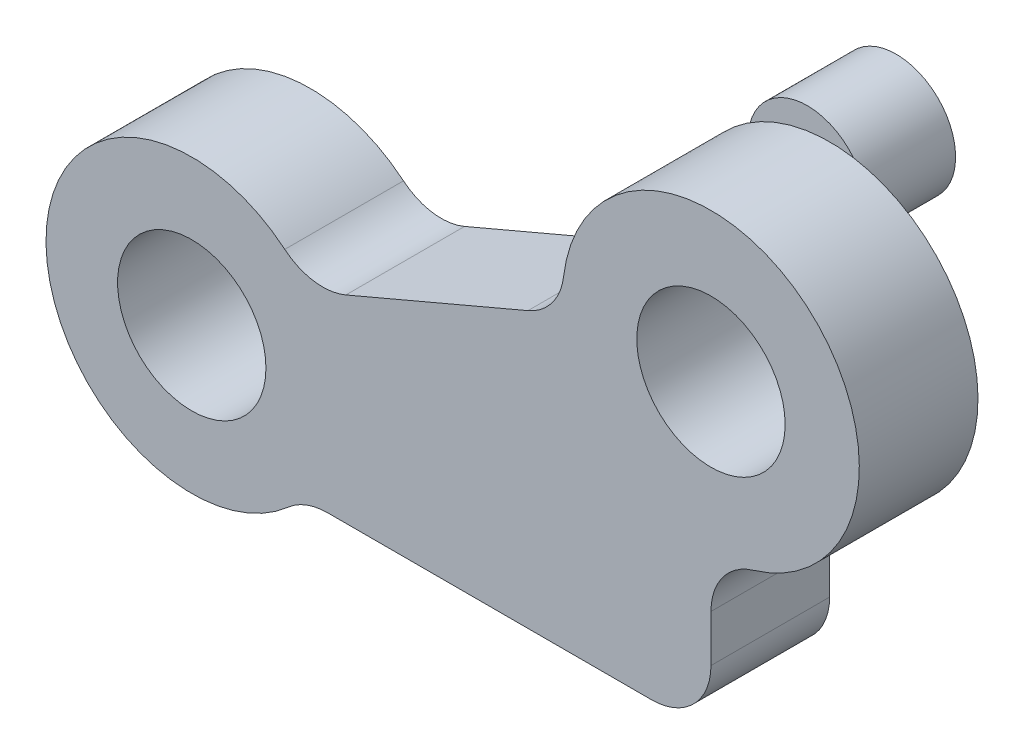
ISO-10303-21;
HEADER;
FILE_DESCRIPTION(('STEP AP214'),'2;1');
FILE_NAME('part.step','',(''),(''),'','','');
FILE_SCHEMA(('AUTOMOTIVE_DESIGN { 1 0 10303 214 1 1 1 1 }'));
ENDSEC;
DATA;
#1=APPLICATION_CONTEXT('core data for automotive mechanical design processes');
#2=APPLICATION_PROTOCOL_DEFINITION('international standard','automotive_design',2000,#1);
#3=PRODUCT_CONTEXT('',#1,'mechanical');
#4=PRODUCT('Part','Part','',(#3));
#5=PRODUCT_RELATED_PRODUCT_CATEGORY('part','',(#4));
#6=PRODUCT_DEFINITION_FORMATION('','',#4);
#7=PRODUCT_DEFINITION_CONTEXT('part definition',#1,'design');
#8=PRODUCT_DEFINITION('design','',#6,#7);
#9=PRODUCT_DEFINITION_SHAPE('','',#8);
#10=(LENGTH_UNIT() NAMED_UNIT(*) SI_UNIT(.MILLI.,.METRE.));
#11=(NAMED_UNIT(*) PLANE_ANGLE_UNIT() SI_UNIT($,.RADIAN.));
#12=(NAMED_UNIT(*) SI_UNIT($,.STERADIAN.) SOLID_ANGLE_UNIT());
#13=UNCERTAINTY_MEASURE_WITH_UNIT(LENGTH_MEASURE(1.E-05),#10,'distance_accuracy_value','');
#14=(GEOMETRIC_REPRESENTATION_CONTEXT(3) GLOBAL_UNCERTAINTY_ASSIGNED_CONTEXT((#13)) GLOBAL_UNIT_ASSIGNED_CONTEXT((#10,
#11,#12)) REPRESENTATION_CONTEXT('',''));
#15=CARTESIAN_POINT('',(0.,0.,0.));
#16=DIRECTION('',(0.,0.,1.));
#17=DIRECTION('',(1.,0.,0.));
#18=AXIS2_PLACEMENT_3D('',#15,#16,#17);
#19=CARTESIAN_POINT('',(56.8390710383438,33.5799198029011,4.));
#20=DIRECTION('',(0.,0.,1.));
#21=DIRECTION('',(1.,0.,0.));
#22=AXIS2_PLACEMENT_3D('',#19,#20,#21);
#23=PLANE('',#22);
#24=CARTESIAN_POINT('',(39.3405929872107,26.4759472363339,4.));
#25=DIRECTION('',(0.,0.,1.));
#26=DIRECTION('',(1.,0.,0.));
#27=AXIS2_PLACEMENT_3D('',#24,#25,#26);
#28=CIRCLE('',#27,2.5);
#29=CARTESIAN_POINT('',(41.8405929872107,26.4759472363339,4.));
#30=VERTEX_POINT('',#29);
#31=EDGE_CURVE('E190',#30,#30,#28,.T.);
#32=ORIENTED_EDGE('',*,*,#31,.F.);
#33=EDGE_LOOP('',(#32));
#34=FACE_BOUND('',#33,.T.);
#35=DIRECTION('',(1.,0.,0.));
#36=VECTOR('',#35,1.);
#37=CARTESIAN_POINT('',(56.8390710383438,23.2923121153975,4.));
#38=LINE('',#37,#36);
#39=CARTESIAN_POINT('',(43.9144347238549,23.2923121153975,4.));
#40=VERTEX_POINT('',#39);
#41=CARTESIAN_POINT('',(54.8390710383438,23.2923121153975,4.));
#42=VERTEX_POINT('',#41);
#43=EDGE_CURVE('E130',#40,#42,#38,.T.);
#44=ORIENTED_EDGE('',*,*,#43,.T.);
#45=CARTESIAN_POINT('',(54.8390710383438,25.2923121153975,4.));
#46=DIRECTION('',(0.,0.,1.));
#47=DIRECTION('',(1.,0.,0.));
#48=AXIS2_PLACEMENT_3D('',#45,#46,#47);
#49=CIRCLE('',#48,2.);
#50=CARTESIAN_POINT('',(56.8390710383438,25.2923121153975,4.));
#51=VERTEX_POINT('',#50);
#52=EDGE_CURVE('E159',#42,#51,#49,.T.);
#53=ORIENTED_EDGE('',*,*,#52,.T.);
#54=DIRECTION('',(0.,1.,0.));
#55=VECTOR('',#54,1.);
#56=CARTESIAN_POINT('',(56.8390710383438,28.5799198029011,4.));
#57=LINE('',#56,#55);
#58=CARTESIAN_POINT('',(56.8390710383438,26.8717158704018,4.));
#59=VERTEX_POINT('',#58);
#60=EDGE_CURVE('E148',#51,#59,#57,.T.);
#61=ORIENTED_EDGE('',*,*,#60,.T.);
#62=CARTESIAN_POINT('',(58.8390710383438,26.8717158704018,4.));
#63=DIRECTION('',(0.,0.,1.));
#64=DIRECTION('',(1.,0.,0.));
#65=AXIS2_PLACEMENT_3D('',#62,#63,#64);
#66=CIRCLE('',#65,2.);
#67=CARTESIAN_POINT('',(58.2676424669152,28.7883455654016,4.));
#68=VERTEX_POINT('',#67);
#69=EDGE_CURVE('E173',#59,#68,#66,.F.);
#70=ORIENTED_EDGE('',*,*,#69,.T.);
#71=CARTESIAN_POINT('',(56.8390710383438,33.5799198029011,4.));
#72=DIRECTION('',(0.,0.,1.));
#73=DIRECTION('',(1.,0.,0.));
#74=AXIS2_PLACEMENT_3D('',#71,#72,#73);
#75=CIRCLE('',#74,5.);
#76=CARTESIAN_POINT('',(51.8742444876987,34.171947945821,4.));
#77=VERTEX_POINT('',#76);
#78=EDGE_CURVE('E142',#68,#77,#75,.T.);
#79=ORIENTED_EDGE('',*,*,#78,.T.);
#80=CARTESIAN_POINT('',(49.8883138674406,34.4087592029889,4.));
#81=DIRECTION('',(0.,0.,1.));
#82=DIRECTION('',(1.,0.,0.));
#83=AXIS2_PLACEMENT_3D('',#80,#81,#82);
#84=CIRCLE('',#83,2.);
#85=CARTESIAN_POINT('',(50.6712787831665,32.5683880608705,4.));
#86=VERTEX_POINT('',#85);
#87=EDGE_CURVE('E11',#77,#86,#84,.F.);
#88=ORIENTED_EDGE('',*,*,#87,.T.);
#89=DIRECTION('',(-0.920185571059233,-0.391482457862919,0.));
#90=VECTOR('',#89,1.);
#91=CARTESIAN_POINT('',(51.8645252002873,33.0760411418385,4.));
#92=LINE('',#91,#90);
#93=CARTESIAN_POINT('',(44.5352579721019,29.9578879789702,4.));
#94=VERTEX_POINT('',#93);
#95=EDGE_CURVE('E193',#86,#94,#92,.T.);
#96=ORIENTED_EDGE('',*,*,#95,.T.);
#97=CARTESIAN_POINT('',(43.752293056376,31.7982591210886,4.));
#98=DIRECTION('',(0.,0.,1.));
#99=DIRECTION('',(1.,0.,0.));
#100=AXIS2_PLACEMENT_3D('',#97,#98,#99);
#101=CIRCLE('',#100,2.);
#102=CARTESIAN_POINT('',(42.4759512366879,30.2584696681713,4.));
#103=VERTEX_POINT('',#102);
#104=EDGE_CURVE('E177',#94,#103,#101,.F.);
#105=ORIENTED_EDGE('',*,*,#104,.T.);
#106=CARTESIAN_POINT('',(39.3405929872107,26.4759472363339,4.));
#107=DIRECTION('',(0.,0.,1.));
#108=DIRECTION('',(1.,0.,0.));
#109=AXIS2_PLACEMENT_3D('',#106,#107,#108);
#110=CIRCLE('',#109,4.91303849973908);
#111=CARTESIAN_POINT('',(42.5911839602965,22.7919812178138,4.));
#112=VERTEX_POINT('',#111);
#113=EDGE_CURVE('E195',#103,#112,#110,.T.);
#114=ORIENTED_EDGE('',*,*,#113,.T.);
#115=CARTESIAN_POINT('',(43.9144347238549,21.2923121153975,4.));
#116=DIRECTION('',(0.,0.,1.));
#117=DIRECTION('',(1.,0.,0.));
#118=AXIS2_PLACEMENT_3D('',#115,#116,#117);
#119=CIRCLE('',#118,2.);
#120=EDGE_CURVE('E121',#112,#40,#119,.F.);
#121=ORIENTED_EDGE('',*,*,#120,.T.);
#122=EDGE_LOOP('',(#44,#53,#61,#70,#79,#88,#96,#105,#114,#121));
#123=FACE_BOUND('',#122,.T.);
#124=CARTESIAN_POINT('',(56.8390710383438,33.5799198029011,4.));
#125=DIRECTION('',(0.,0.,1.));
#126=DIRECTION('',(1.,0.,0.));
#127=AXIS2_PLACEMENT_3D('',#124,#125,#126);
#128=CIRCLE('',#127,2.5);
#129=CARTESIAN_POINT('',(59.3390710383438,33.5799198029011,4.));
#130=VERTEX_POINT('',#129);
#131=EDGE_CURVE('E332',#130,#130,#128,.T.);
#132=ORIENTED_EDGE('',*,*,#131,.F.);
#133=EDGE_LOOP('',(#132));
#134=FACE_BOUND('',#133,.T.);
#135=ADVANCED_FACE('F33',(#34,#123,#134),#23,.T.);
#136=CARTESIAN_POINT('',(56.8390710383438,33.5799198029011,0.));
#137=DIRECTION('',(0.,0.,1.));
#138=DIRECTION('',(1.,0.,0.));
#139=AXIS2_PLACEMENT_3D('',#136,#137,#138);
#140=PLANE('',#139);
#141=CARTESIAN_POINT('',(46.1838105404892,27.3596066911274,0.));
#142=DIRECTION('',(0.,0.,1.));
#143=DIRECTION('',(1.,0.,0.));
#144=AXIS2_PLACEMENT_3D('',#141,#142,#143);
#145=CIRCLE('',#144,0.999999999999998);
#146=CARTESIAN_POINT('',(47.1838105404892,27.3596066911274,0.));
#147=VERTEX_POINT('',#146);
#148=EDGE_CURVE('E37',#147,#147,#145,.T.);
#149=ORIENTED_EDGE('',*,*,#148,.T.);
#150=EDGE_LOOP('',(#149));
#151=FACE_BOUND('',#150,.T.);
#152=DIRECTION('',(0.,1.,0.));
#153=VECTOR('',#152,1.);
#154=CARTESIAN_POINT('',(56.8390710383438,28.5799198029011,0.));
#155=LINE('',#154,#153);
#156=CARTESIAN_POINT('',(56.8390710383438,25.2923121153975,0.));
#157=VERTEX_POINT('',#156);
#158=CARTESIAN_POINT('',(56.8390710383438,26.8717158704018,0.));
#159=VERTEX_POINT('',#158);
#160=EDGE_CURVE('E138',#157,#159,#155,.T.);
#161=ORIENTED_EDGE('',*,*,#160,.F.);
#162=CARTESIAN_POINT('',(54.8390710383438,25.2923121153975,0.));
#163=DIRECTION('',(0.,0.,1.));
#164=DIRECTION('',(1.,0.,0.));
#165=AXIS2_PLACEMENT_3D('',#162,#163,#164);
#166=CIRCLE('',#165,2.);
#167=CARTESIAN_POINT('',(54.8390710383438,23.2923121153975,0.));
#168=VERTEX_POINT('',#167);
#169=EDGE_CURVE('E137',#157,#168,#166,.F.);
#170=ORIENTED_EDGE('',*,*,#169,.T.);
#171=DIRECTION('',(1.,0.,0.));
#172=VECTOR('',#171,1.);
#173=CARTESIAN_POINT('',(56.8390710383438,23.2923121153975,0.));
#174=LINE('',#173,#172);
#175=CARTESIAN_POINT('',(43.9144347238549,23.2923121153975,0.));
#176=VERTEX_POINT('',#175);
#177=EDGE_CURVE('E127',#176,#168,#174,.T.);
#178=ORIENTED_EDGE('',*,*,#177,.F.);
#179=CARTESIAN_POINT('',(43.9144347238549,21.2923121153975,0.));
#180=DIRECTION('',(0.,0.,1.));
#181=DIRECTION('',(1.,0.,0.));
#182=AXIS2_PLACEMENT_3D('',#179,#180,#181);
#183=CIRCLE('',#182,2.);
#184=CARTESIAN_POINT('',(42.5911839602965,22.7919812178138,0.));
#185=VERTEX_POINT('',#184);
#186=EDGE_CURVE('E111',#176,#185,#183,.T.);
#187=ORIENTED_EDGE('',*,*,#186,.T.);
#188=CARTESIAN_POINT('',(39.3405929872107,26.4759472363339,0.));
#189=DIRECTION('',(0.,0.,1.));
#190=DIRECTION('',(1.,0.,0.));
#191=AXIS2_PLACEMENT_3D('',#188,#189,#190);
#192=CIRCLE('',#191,4.91303849973908);
#193=CARTESIAN_POINT('',(42.4759512366879,30.2584696681713,0.));
#194=VERTEX_POINT('',#193);
#195=EDGE_CURVE('E139',#194,#185,#192,.T.);
#196=ORIENTED_EDGE('',*,*,#195,.F.);
#197=CARTESIAN_POINT('',(43.752293056376,31.7982591210886,0.));
#198=DIRECTION('',(0.,0.,1.));
#199=DIRECTION('',(1.,0.,0.));
#200=AXIS2_PLACEMENT_3D('',#197,#198,#199);
#201=CIRCLE('',#200,2.);
#202=CARTESIAN_POINT('',(44.5352579721019,29.9578879789702,0.));
#203=VERTEX_POINT('',#202);
#204=EDGE_CURVE('E175',#194,#203,#201,.T.);
#205=ORIENTED_EDGE('',*,*,#204,.T.);
#206=DIRECTION('',(-0.920185571059233,-0.391482457862919,0.));
#207=VECTOR('',#206,1.);
#208=CARTESIAN_POINT('',(51.8645252002873,33.0760411418385,0.));
#209=LINE('',#208,#207);
#210=CARTESIAN_POINT('',(50.6712787831665,32.5683880608705,0.));
#211=VERTEX_POINT('',#210);
#212=EDGE_CURVE('E144',#211,#203,#209,.T.);
#213=ORIENTED_EDGE('',*,*,#212,.F.);
#214=CARTESIAN_POINT('',(49.8883138674406,34.4087592029889,0.));
#215=DIRECTION('',(0.,0.,1.));
#216=DIRECTION('',(1.,0.,0.));
#217=AXIS2_PLACEMENT_3D('',#214,#215,#216);
#218=CIRCLE('',#217,2.);
#219=CARTESIAN_POINT('',(51.8742444876987,34.171947945821,0.));
#220=VERTEX_POINT('',#219);
#221=EDGE_CURVE('E42',#211,#220,#218,.T.);
#222=ORIENTED_EDGE('',*,*,#221,.T.);
#223=CARTESIAN_POINT('',(56.8390710383438,33.5799198029011,0.));
#224=DIRECTION('',(0.,0.,1.));
#225=DIRECTION('',(1.,0.,0.));
#226=AXIS2_PLACEMENT_3D('',#223,#224,#225);
#227=CIRCLE('',#226,5.);
#228=CARTESIAN_POINT('',(58.2676424669152,28.7883455654016,0.));
#229=VERTEX_POINT('',#228);
#230=EDGE_CURVE('E182',#229,#220,#227,.T.);
#231=ORIENTED_EDGE('',*,*,#230,.F.);
#232=CARTESIAN_POINT('',(58.8390710383438,26.8717158704018,0.));
#233=DIRECTION('',(0.,0.,1.));
#234=DIRECTION('',(1.,0.,0.));
#235=AXIS2_PLACEMENT_3D('',#232,#233,#234);
#236=CIRCLE('',#235,2.);
#237=EDGE_CURVE('E171',#229,#159,#236,.T.);
#238=ORIENTED_EDGE('',*,*,#237,.T.);
#239=EDGE_LOOP('',(#161,#170,#178,#187,#196,#205,#213,#222,#231,#238));
#240=FACE_BOUND('',#239,.T.);
#241=CARTESIAN_POINT('',(39.3405929872107,26.4759472363339,0.));
#242=DIRECTION('',(0.,0.,1.));
#243=DIRECTION('',(1.,0.,0.));
#244=AXIS2_PLACEMENT_3D('',#241,#242,#243);
#245=CIRCLE('',#244,2.5);
#246=CARTESIAN_POINT('',(41.8405929872107,26.4759472363339,0.));
#247=VERTEX_POINT('',#246);
#248=EDGE_CURVE('E338',#247,#247,#245,.T.);
#249=ORIENTED_EDGE('',*,*,#248,.T.);
#250=EDGE_LOOP('',(#249));
#251=FACE_BOUND('',#250,.T.);
#252=CARTESIAN_POINT('',(56.8390710383438,33.5799198029011,0.));
#253=DIRECTION('',(0.,0.,1.));
#254=DIRECTION('',(1.,0.,0.));
#255=AXIS2_PLACEMENT_3D('',#252,#253,#254);
#256=CIRCLE('',#255,2.5);
#257=CARTESIAN_POINT('',(59.3390710383438,33.5799198029011,0.));
#258=VERTEX_POINT('',#257);
#259=EDGE_CURVE('E335',#258,#258,#256,.T.);
#260=ORIENTED_EDGE('',*,*,#259,.T.);
#261=EDGE_LOOP('',(#260));
#262=FACE_BOUND('',#261,.T.);
#263=ADVANCED_FACE('F135',(#151,#240,#251,#262),#140,.F.);
#264=CARTESIAN_POINT('',(56.8390710383438,33.5799198029011,4.));
#265=DIRECTION('',(0.,0.,-1.));
#266=DIRECTION('',(-1.,0.,0.));
#267=AXIS2_PLACEMENT_3D('',#264,#265,#266);
#268=CYLINDRICAL_SURFACE('',#267,5.);
#269=ORIENTED_EDGE('',*,*,#78,.F.);
#270=DIRECTION('',(0.,0.,-1.));
#271=VECTOR('',#270,1.);
#272=CARTESIAN_POINT('',(58.2676424669152,28.7883455654016,4.));
#273=LINE('',#272,#271);
#274=EDGE_CURVE('E163',#68,#229,#273,.T.);
#275=ORIENTED_EDGE('',*,*,#274,.T.);
#276=ORIENTED_EDGE('',*,*,#230,.T.);
#277=DIRECTION('',(0.,0.,-1.));
#278=VECTOR('',#277,1.);
#279=CARTESIAN_POINT('',(51.8742444876987,34.171947945821,4.));
#280=LINE('',#279,#278);
#281=EDGE_CURVE('E161',#220,#77,#280,.F.);
#282=ORIENTED_EDGE('',*,*,#281,.T.);
#283=EDGE_LOOP('',(#269,#275,#276,#282));
#284=FACE_BOUND('',#283,.T.);
#285=ADVANCED_FACE('F188',(#284),#268,.T.);
#286=CARTESIAN_POINT('',(51.8645252002873,33.0760411418385,4.));
#287=DIRECTION('',(0.391482457862919,-0.920185571059234,0.));
#288=DIRECTION('',(0.920185571059234,0.391482457862919,0.));
#289=AXIS2_PLACEMENT_3D('',#286,#287,#288);
#290=PLANE('',#289);
#291=ORIENTED_EDGE('',*,*,#212,.T.);
#292=DIRECTION('',(0.,0.,1.));
#293=VECTOR('',#292,1.);
#294=CARTESIAN_POINT('',(44.5352579721019,29.9578879789702,4.));
#295=LINE('',#294,#293);
#296=EDGE_CURVE('E49',#203,#94,#295,.T.);
#297=ORIENTED_EDGE('',*,*,#296,.T.);
#298=ORIENTED_EDGE('',*,*,#95,.F.);
#299=DIRECTION('',(0.,0.,1.));
#300=VECTOR('',#299,1.);
#301=CARTESIAN_POINT('',(50.6712787831665,32.5683880608705,0.));
#302=LINE('',#301,#300);
#303=EDGE_CURVE('E166',#86,#211,#302,.F.);
#304=ORIENTED_EDGE('',*,*,#303,.T.);
#305=EDGE_LOOP('',(#291,#297,#298,#304));
#306=FACE_BOUND('',#305,.T.);
#307=ADVANCED_FACE('F192',(#306),#290,.F.);
#308=CARTESIAN_POINT('',(39.3405929872107,26.4759472363339,4.));
#309=DIRECTION('',(0.,0.,-1.));
#310=DIRECTION('',(-1.,0.,0.));
#311=AXIS2_PLACEMENT_3D('',#308,#309,#310);
#312=CYLINDRICAL_SURFACE('',#311,4.91303849973908);
#313=ORIENTED_EDGE('',*,*,#195,.T.);
#314=DIRECTION('',(0.,0.,-1.));
#315=VECTOR('',#314,1.);
#316=CARTESIAN_POINT('',(42.5911839602965,22.7919812178138,4.));
#317=LINE('',#316,#315);
#318=EDGE_CURVE('E116',#185,#112,#317,.F.);
#319=ORIENTED_EDGE('',*,*,#318,.T.);
#320=ORIENTED_EDGE('',*,*,#113,.F.);
#321=DIRECTION('',(0.,0.,-1.));
#322=VECTOR('',#321,1.);
#323=CARTESIAN_POINT('',(42.4759512366879,30.2584696681713,4.));
#324=LINE('',#323,#322);
#325=EDGE_CURVE('E131',#103,#194,#324,.T.);
#326=ORIENTED_EDGE('',*,*,#325,.T.);
#327=EDGE_LOOP('',(#313,#319,#320,#326));
#328=FACE_BOUND('',#327,.T.);
#329=ADVANCED_FACE('F219',(#328),#312,.T.);
#330=CARTESIAN_POINT('',(56.8390710383438,23.2923121153975,4.));
#331=DIRECTION('',(0.,1.,0.));
#332=DIRECTION('',(0.,0.,1.));
#333=AXIS2_PLACEMENT_3D('',#330,#331,#332);
#334=PLANE('',#333);
#335=ORIENTED_EDGE('',*,*,#43,.F.);
#336=DIRECTION('',(0.,0.,1.));
#337=VECTOR('',#336,1.);
#338=CARTESIAN_POINT('',(43.9144347238549,23.2923121153975,0.));
#339=LINE('',#338,#337);
#340=EDGE_CURVE('E115',#40,#176,#339,.F.);
#341=ORIENTED_EDGE('',*,*,#340,.T.);
#342=ORIENTED_EDGE('',*,*,#177,.T.);
#343=DIRECTION('',(0.,0.,-1.));
#344=VECTOR('',#343,1.);
#345=CARTESIAN_POINT('',(54.8390710383438,23.2923121153975,4.));
#346=LINE('',#345,#344);
#347=EDGE_CURVE('E132',#168,#42,#346,.F.);
#348=ORIENTED_EDGE('',*,*,#347,.T.);
#349=EDGE_LOOP('',(#335,#341,#342,#348));
#350=FACE_BOUND('',#349,.T.);
#351=ADVANCED_FACE('F126',(#350),#334,.F.);
#352=CARTESIAN_POINT('',(56.8390710383438,28.5799198029011,4.));
#353=DIRECTION('',(-1.,0.,0.));
#354=DIRECTION('',(0.,0.,1.));
#355=AXIS2_PLACEMENT_3D('',#352,#353,#354);
#356=PLANE('',#355);
#357=ORIENTED_EDGE('',*,*,#60,.F.);
#358=DIRECTION('',(0.,0.,-1.));
#359=VECTOR('',#358,1.);
#360=CARTESIAN_POINT('',(56.8390710383438,25.2923121153975,4.));
#361=LINE('',#360,#359);
#362=EDGE_CURVE('E155',#51,#157,#361,.T.);
#363=ORIENTED_EDGE('',*,*,#362,.T.);
#364=ORIENTED_EDGE('',*,*,#160,.T.);
#365=DIRECTION('',(0.,0.,1.));
#366=VECTOR('',#365,1.);
#367=CARTESIAN_POINT('',(56.8390710383438,26.8717158704018,4.));
#368=LINE('',#367,#366);
#369=EDGE_CURVE('E153',#159,#59,#368,.T.);
#370=ORIENTED_EDGE('',*,*,#369,.T.);
#371=EDGE_LOOP('',(#357,#363,#364,#370));
#372=FACE_BOUND('',#371,.T.);
#373=ADVANCED_FACE('F213',(#372),#356,.F.);
#374=CARTESIAN_POINT('',(39.3405929872107,26.4759472363339,4.));
#375=DIRECTION('',(0.,0.,-1.));
#376=DIRECTION('',(-1.,0.,0.));
#377=AXIS2_PLACEMENT_3D('',#374,#375,#376);
#378=CYLINDRICAL_SURFACE('',#377,2.5);
#379=ORIENTED_EDGE('',*,*,#31,.T.);
#380=EDGE_LOOP('',(#379));
#381=FACE_BOUND('',#380,.T.);
#382=ORIENTED_EDGE('',*,*,#248,.F.);
#383=EDGE_LOOP('',(#382));
#384=FACE_BOUND('',#383,.T.);
#385=ADVANCED_FACE('F240',(#381,#384),#378,.F.);
#386=CARTESIAN_POINT('',(56.8390710383438,33.5799198029011,4.));
#387=DIRECTION('',(0.,0.,-1.));
#388=DIRECTION('',(-1.,0.,0.));
#389=AXIS2_PLACEMENT_3D('',#386,#387,#388);
#390=CYLINDRICAL_SURFACE('',#389,2.5);
#391=ORIENTED_EDGE('',*,*,#131,.T.);
#392=EDGE_LOOP('',(#391));
#393=FACE_BOUND('',#392,.T.);
#394=ORIENTED_EDGE('',*,*,#259,.F.);
#395=EDGE_LOOP('',(#394));
#396=FACE_BOUND('',#395,.T.);
#397=ADVANCED_FACE('F255',(#393,#396),#390,.F.);
#398=CARTESIAN_POINT('',(43.9144347238549,21.2923121153975,4.));
#399=DIRECTION('',(0.,0.,-1.));
#400=DIRECTION('',(-1.,0.,0.));
#401=AXIS2_PLACEMENT_3D('',#398,#399,#400);
#402=CYLINDRICAL_SURFACE('',#401,2.);
#403=ORIENTED_EDGE('',*,*,#120,.F.);
#404=ORIENTED_EDGE('',*,*,#318,.F.);
#405=ORIENTED_EDGE('',*,*,#186,.F.);
#406=ORIENTED_EDGE('',*,*,#340,.F.);
#407=EDGE_LOOP('',(#403,#404,#405,#406));
#408=FACE_BOUND('',#407,.T.);
#409=ADVANCED_FACE('F114',(#408),#402,.F.);
#410=CARTESIAN_POINT('',(54.8390710383438,25.2923121153975,4.));
#411=DIRECTION('',(0.,0.,-1.));
#412=DIRECTION('',(-1.,0.,0.));
#413=AXIS2_PLACEMENT_3D('',#410,#411,#412);
#414=CYLINDRICAL_SURFACE('',#413,2.);
#415=ORIENTED_EDGE('',*,*,#52,.F.);
#416=ORIENTED_EDGE('',*,*,#347,.F.);
#417=ORIENTED_EDGE('',*,*,#169,.F.);
#418=ORIENTED_EDGE('',*,*,#362,.F.);
#419=EDGE_LOOP('',(#415,#416,#417,#418));
#420=FACE_BOUND('',#419,.T.);
#421=ADVANCED_FACE('F215',(#420),#414,.T.);
#422=CARTESIAN_POINT('',(58.8390710383438,26.8717158704018,4.));
#423=DIRECTION('',(0.,0.,-1.));
#424=DIRECTION('',(-1.,0.,0.));
#425=AXIS2_PLACEMENT_3D('',#422,#423,#424);
#426=CYLINDRICAL_SURFACE('',#425,2.);
#427=ORIENTED_EDGE('',*,*,#69,.F.);
#428=ORIENTED_EDGE('',*,*,#369,.F.);
#429=ORIENTED_EDGE('',*,*,#237,.F.);
#430=ORIENTED_EDGE('',*,*,#274,.F.);
#431=EDGE_LOOP('',(#427,#428,#429,#430));
#432=FACE_BOUND('',#431,.T.);
#433=ADVANCED_FACE('F212',(#432),#426,.F.);
#434=CARTESIAN_POINT('',(43.752293056376,31.7982591210886,4.));
#435=DIRECTION('',(0.,0.,-1.));
#436=DIRECTION('',(-1.,0.,0.));
#437=AXIS2_PLACEMENT_3D('',#434,#435,#436);
#438=CYLINDRICAL_SURFACE('',#437,2.);
#439=ORIENTED_EDGE('',*,*,#104,.F.);
#440=ORIENTED_EDGE('',*,*,#296,.F.);
#441=ORIENTED_EDGE('',*,*,#204,.F.);
#442=ORIENTED_EDGE('',*,*,#325,.F.);
#443=EDGE_LOOP('',(#439,#440,#441,#442));
#444=FACE_BOUND('',#443,.T.);
#445=ADVANCED_FACE('F221',(#444),#438,.F.);
#446=CARTESIAN_POINT('',(49.8883138674406,34.4087592029889,4.));
#447=DIRECTION('',(0.,0.,-1.));
#448=DIRECTION('',(-1.,0.,0.));
#449=AXIS2_PLACEMENT_3D('',#446,#447,#448);
#450=CYLINDRICAL_SURFACE('',#449,2.);
#451=ORIENTED_EDGE('',*,*,#87,.F.);
#452=ORIENTED_EDGE('',*,*,#281,.F.);
#453=ORIENTED_EDGE('',*,*,#221,.F.);
#454=ORIENTED_EDGE('',*,*,#303,.F.);
#455=EDGE_LOOP('',(#451,#452,#453,#454));
#456=FACE_BOUND('',#455,.T.);
#457=ADVANCED_FACE('F35',(#456),#450,.F.);
#458=CARTESIAN_POINT('',(46.1838105404892,27.3596066911274,-9.9));
#459=DIRECTION('',(0.,0.,1.));
#460=DIRECTION('',(1.,0.,0.));
#461=AXIS2_PLACEMENT_3D('',#458,#459,#460);
#462=CYLINDRICAL_SURFACE('',#461,0.999999999999998);
#463=CARTESIAN_POINT('',(46.1838105404892,27.3596066911274,-9.9));
#464=DIRECTION('',(0.,0.,1.));
#465=DIRECTION('',(1.,0.,0.));
#466=AXIS2_PLACEMENT_3D('',#463,#464,#465);
#467=CIRCLE('',#466,0.999999999999998);
#468=CARTESIAN_POINT('',(47.1838105404892,27.3596066911274,-9.9));
#469=VERTEX_POINT('',#468);
#470=EDGE_CURVE('E341',#469,#469,#467,.T.);
#471=ORIENTED_EDGE('',*,*,#470,.T.);
#472=EDGE_LOOP('',(#471));
#473=FACE_BOUND('',#472,.T.);
#474=ORIENTED_EDGE('',*,*,#148,.F.);
#475=EDGE_LOOP('',(#474));
#476=FACE_BOUND('',#475,.T.);
#477=ADVANCED_FACE('F227',(#473,#476),#462,.T.);
#478=CARTESIAN_POINT('',(46.1838105404892,27.3596066911274,-12.9));
#479=DIRECTION('',(0.,0.,1.));
#480=DIRECTION('',(1.,0.,0.));
#481=AXIS2_PLACEMENT_3D('',#478,#479,#480);
#482=CYLINDRICAL_SURFACE('',#481,2.);
#483=CARTESIAN_POINT('',(46.1838105404892,27.3596066911274,-12.9));
#484=DIRECTION('',(0.,0.,-1.));
#485=DIRECTION('',(-1.,0.,0.));
#486=AXIS2_PLACEMENT_3D('',#483,#484,#485);
#487=CIRCLE('',#486,2.);
#488=CARTESIAN_POINT('',(44.1838105404892,27.3596066911274,-12.9));
#489=VERTEX_POINT('',#488);
#490=EDGE_CURVE('E350',#489,#489,#487,.T.);
#491=ORIENTED_EDGE('',*,*,#490,.F.);
#492=EDGE_LOOP('',(#491));
#493=FACE_BOUND('',#492,.T.);
#494=CARTESIAN_POINT('',(46.1838105404892,27.3596066911274,-9.9));
#495=DIRECTION('',(0.,0.,-1.));
#496=DIRECTION('',(-1.,0.,0.));
#497=AXIS2_PLACEMENT_3D('',#494,#495,#496);
#498=CIRCLE('',#497,2.);
#499=CARTESIAN_POINT('',(44.1838105404892,27.3596066911274,-9.9));
#500=VERTEX_POINT('',#499);
#501=EDGE_CURVE('E351',#500,#500,#498,.T.);
#502=ORIENTED_EDGE('',*,*,#501,.T.);
#503=EDGE_LOOP('',(#502));
#504=FACE_BOUND('',#503,.T.);
#505=ADVANCED_FACE('F288',(#493,#504),#482,.T.);
#506=CARTESIAN_POINT('',(46.1838105404892,27.3596066911274,-12.9));
#507=DIRECTION('',(0.,0.,-1.));
#508=DIRECTION('',(-1.,0.,0.));
#509=AXIS2_PLACEMENT_3D('',#506,#507,#508);
#510=PLANE('',#509);
#511=ORIENTED_EDGE('',*,*,#490,.T.);
#512=EDGE_LOOP('',(#511));
#513=FACE_BOUND('',#512,.T.);
#514=ADVANCED_FACE('F298',(#513),#510,.T.);
#515=CARTESIAN_POINT('',(46.1838105404892,27.3596066911274,-9.9));
#516=DIRECTION('',(0.,0.,-1.));
#517=DIRECTION('',(-1.,0.,0.));
#518=AXIS2_PLACEMENT_3D('',#515,#516,#517);
#519=PLANE('',#518);
#520=ORIENTED_EDGE('',*,*,#470,.F.);
#521=EDGE_LOOP('',(#520));
#522=FACE_BOUND('',#521,.T.);
#523=ORIENTED_EDGE('',*,*,#501,.F.);
#524=EDGE_LOOP('',(#523));
#525=FACE_BOUND('',#524,.T.);
#526=ADVANCED_FACE('F308',(#522,#525),#519,.F.);
#527=CLOSED_SHELL('',(#135,#263,#285,#307,#329,#351,#373,#385,#397,#409,#421,#433,#445,#457,
#477,#505,#514,#526));
#528=MANIFOLD_SOLID_BREP('B2',#527);
#529=ADVANCED_BREP_SHAPE_REPRESENTATION('',(#18,#528),#14);
#530=SHAPE_DEFINITION_REPRESENTATION(#9,#529);
ENDSEC;
END-ISO-10303-21;
